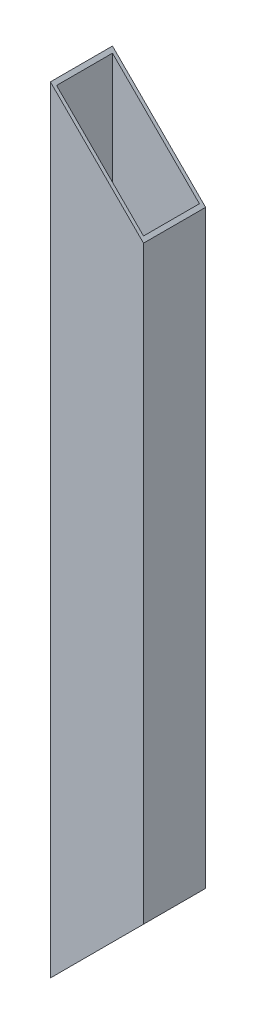
ISO-10303-21;
HEADER;
FILE_DESCRIPTION(('STEP AP214'),'2;1');
FILE_NAME('part.step','',(''),(''),'','','');
FILE_SCHEMA(('AUTOMOTIVE_DESIGN { 1 0 10303 214 1 1 1 1 }'));
ENDSEC;
DATA;
#1=APPLICATION_CONTEXT('core data for automotive mechanical design processes');
#2=APPLICATION_PROTOCOL_DEFINITION('international standard','automotive_design',2000,#1);
#3=PRODUCT_CONTEXT('',#1,'mechanical');
#4=PRODUCT('Part','Part','',(#3));
#5=PRODUCT_RELATED_PRODUCT_CATEGORY('part','',(#4));
#6=PRODUCT_DEFINITION_FORMATION('','',#4);
#7=PRODUCT_DEFINITION_CONTEXT('part definition',#1,'design');
#8=PRODUCT_DEFINITION('design','',#6,#7);
#9=PRODUCT_DEFINITION_SHAPE('','',#8);
#10=(LENGTH_UNIT() NAMED_UNIT(*) SI_UNIT(.MILLI.,.METRE.));
#11=(NAMED_UNIT(*) PLANE_ANGLE_UNIT() SI_UNIT($,.RADIAN.));
#12=(NAMED_UNIT(*) SI_UNIT($,.STERADIAN.) SOLID_ANGLE_UNIT());
#13=UNCERTAINTY_MEASURE_WITH_UNIT(LENGTH_MEASURE(1.E-05),#10,'distance_accuracy_value','');
#14=(GEOMETRIC_REPRESENTATION_CONTEXT(3) GLOBAL_UNCERTAINTY_ASSIGNED_CONTEXT((#13)) GLOBAL_UNIT_ASSIGNED_CONTEXT((#10,
#11,#12)) REPRESENTATION_CONTEXT('',''));
#15=CARTESIAN_POINT('',(0.,0.,0.));
#16=DIRECTION('',(0.,0.,1.));
#17=DIRECTION('',(1.,0.,0.));
#18=AXIS2_PLACEMENT_3D('',#15,#16,#17);
#19=CARTESIAN_POINT('',(2.,500.,-38.));
#20=DIRECTION('',(0.,0.,1.));
#21=DIRECTION('',(1.,0.,0.));
#22=AXIS2_PLACEMENT_3D('',#19,#20,#21);
#23=PLANE('',#22);
#24=DIRECTION('',(0.,-1.,0.));
#25=VECTOR('',#24,1.);
#26=CARTESIAN_POINT('',(58.,500.,-38.));
#27=LINE('',#26,#25);
#28=CARTESIAN_POINT('',(58.,442.,-38.));
#29=VERTEX_POINT('',#28);
#30=CARTESIAN_POINT('',(58.,58.0000000000006,-38.));
#31=VERTEX_POINT('',#30);
#32=EDGE_CURVE('E150',#29,#31,#27,.T.);
#33=ORIENTED_EDGE('',*,*,#32,.F.);
#34=DIRECTION('',(-0.707106781186546,0.707106781186549,0.));
#35=VECTOR('',#34,1.);
#36=CARTESIAN_POINT('',(0.999999999999982,499.,-38.));
#37=LINE('',#36,#35);
#38=CARTESIAN_POINT('',(1.99999999999999,498.,-38.));
#39=VERTEX_POINT('',#38);
#40=EDGE_CURVE('E11',#29,#39,#37,.T.);
#41=ORIENTED_EDGE('',*,*,#40,.T.);
#42=DIRECTION('',(0.,-1.,0.));
#43=VECTOR('',#42,1.);
#44=CARTESIAN_POINT('',(2.,500.,-38.));
#45=LINE('',#44,#43);
#46=CARTESIAN_POINT('',(2.00000000000003,2.00000000000009,-38.));
#47=VERTEX_POINT('',#46);
#48=EDGE_CURVE('E145',#39,#47,#45,.T.);
#49=ORIENTED_EDGE('',*,*,#48,.T.);
#50=DIRECTION('',(-0.707106781186544,-0.707106781186551,0.));
#51=VECTOR('',#50,1.);
#52=CARTESIAN_POINT('',(251.,251.000000000003,-38.));
#53=LINE('',#52,#51);
#54=EDGE_CURVE('E41',#31,#47,#53,.T.);
#55=ORIENTED_EDGE('',*,*,#54,.F.);
#56=EDGE_LOOP('',(#33,#41,#49,#55));
#57=FACE_BOUND('',#56,.T.);
#58=ADVANCED_FACE('F33',(#57),#23,.T.);
#59=CARTESIAN_POINT('',(58.,500.,-38.));
#60=DIRECTION('',(-1.,0.,0.));
#61=DIRECTION('',(0.,0.,1.));
#62=AXIS2_PLACEMENT_3D('',#59,#60,#61);
#63=PLANE('',#62);
#64=DIRECTION('',(0.,-1.,0.));
#65=VECTOR('',#64,1.);
#66=CARTESIAN_POINT('',(58.,500.,-2.));
#67=LINE('',#66,#65);
#68=CARTESIAN_POINT('',(58.,442.,-2.));
#69=VERTEX_POINT('',#68);
#70=CARTESIAN_POINT('',(58.,58.0000000000007,-2.));
#71=VERTEX_POINT('',#70);
#72=EDGE_CURVE('E153',#69,#71,#67,.T.);
#73=ORIENTED_EDGE('',*,*,#72,.F.);
#74=DIRECTION('',(0.,0.,-1.));
#75=VECTOR('',#74,1.);
#76=CARTESIAN_POINT('',(58.,442.,-38.));
#77=LINE('',#76,#75);
#78=EDGE_CURVE('E166',#69,#29,#77,.T.);
#79=ORIENTED_EDGE('',*,*,#78,.T.);
#80=ORIENTED_EDGE('',*,*,#32,.T.);
#81=DIRECTION('',(0.,0.,-1.));
#82=VECTOR('',#81,1.);
#83=CARTESIAN_POINT('',(58.,58.0000000000007,-37.9999999999999));
#84=LINE('',#83,#82);
#85=EDGE_CURVE('E136',#71,#31,#84,.T.);
#86=ORIENTED_EDGE('',*,*,#85,.F.);
#87=EDGE_LOOP('',(#73,#79,#80,#86));
#88=FACE_BOUND('',#87,.T.);
#89=ADVANCED_FACE('F165',(#88),#63,.T.);
#90=CARTESIAN_POINT('',(2.,500.,-2.));
#91=DIRECTION('',(0.,0.,-1.));
#92=DIRECTION('',(-1.,0.,0.));
#93=AXIS2_PLACEMENT_3D('',#90,#91,#92);
#94=PLANE('',#93);
#95=DIRECTION('',(0.,-1.,0.));
#96=VECTOR('',#95,1.);
#97=CARTESIAN_POINT('',(2.,500.,-2.));
#98=LINE('',#97,#96);
#99=CARTESIAN_POINT('',(2.,498.,-2.));
#100=VERTEX_POINT('',#99);
#101=CARTESIAN_POINT('',(2.,2.,-2.));
#102=VERTEX_POINT('',#101);
#103=EDGE_CURVE('E119',#100,#102,#98,.T.);
#104=ORIENTED_EDGE('',*,*,#103,.F.);
#105=DIRECTION('',(0.707106781186546,-0.707106781186549,0.));
#106=VECTOR('',#105,1.);
#107=CARTESIAN_POINT('',(0.999999999999987,499.,-2.));
#108=LINE('',#107,#106);
#109=EDGE_CURVE('E162',#100,#69,#108,.T.);
#110=ORIENTED_EDGE('',*,*,#109,.T.);
#111=ORIENTED_EDGE('',*,*,#72,.T.);
#112=DIRECTION('',(0.707106781186544,0.707106781186551,0.));
#113=VECTOR('',#112,1.);
#114=CARTESIAN_POINT('',(251.,251.000000000003,-2.));
#115=LINE('',#114,#113);
#116=EDGE_CURVE('E148',#102,#71,#115,.T.);
#117=ORIENTED_EDGE('',*,*,#116,.F.);
#118=EDGE_LOOP('',(#104,#110,#111,#117));
#119=FACE_BOUND('',#118,.T.);
#120=ADVANCED_FACE('F161',(#119),#94,.T.);
#121=CARTESIAN_POINT('',(2.,500.,-38.));
#122=DIRECTION('',(1.,0.,0.));
#123=DIRECTION('',(0.,0.,-1.));
#124=AXIS2_PLACEMENT_3D('',#121,#122,#123);
#125=PLANE('',#124);
#126=ORIENTED_EDGE('',*,*,#48,.F.);
#127=DIRECTION('',(0.,0.,1.));
#128=VECTOR('',#127,1.);
#129=CARTESIAN_POINT('',(2.,498.,-38.));
#130=LINE('',#129,#128);
#131=EDGE_CURVE('E56',#39,#100,#130,.T.);
#132=ORIENTED_EDGE('',*,*,#131,.T.);
#133=ORIENTED_EDGE('',*,*,#103,.T.);
#134=DIRECTION('',(0.,0.,1.));
#135=VECTOR('',#134,1.);
#136=CARTESIAN_POINT('',(2.,2.00000000000006,-37.9999999999999));
#137=LINE('',#136,#135);
#138=EDGE_CURVE('E133',#47,#102,#137,.T.);
#139=ORIENTED_EDGE('',*,*,#138,.F.);
#140=EDGE_LOOP('',(#126,#132,#133,#139));
#141=FACE_BOUND('',#140,.T.);
#142=ADVANCED_FACE('F144',(#141),#125,.T.);
#143=CARTESIAN_POINT('',(0.,0.,660.));
#144=DIRECTION('',(-0.707106781186551,0.707106781186544,0.));
#145=DIRECTION('',(-0.707106781186544,-0.707106781186551,0.));
#146=AXIS2_PLACEMENT_3D('',#143,#144,#145);
#147=PLANE('',#146);
#148=ORIENTED_EDGE('',*,*,#138,.T.);
#149=ORIENTED_EDGE('',*,*,#116,.T.);
#150=ORIENTED_EDGE('',*,*,#85,.T.);
#151=ORIENTED_EDGE('',*,*,#54,.T.);
#152=EDGE_LOOP('',(#148,#149,#150,#151));
#153=FACE_BOUND('',#152,.T.);
#154=DIRECTION('',(0.,0.,1.));
#155=VECTOR('',#154,1.);
#156=CARTESIAN_POINT('',(0.,0.,0.));
#157=LINE('',#156,#155);
#158=CARTESIAN_POINT('',(0.,0.,-40.));
#159=VERTEX_POINT('',#158);
#160=CARTESIAN_POINT('',(0.,0.,0.));
#161=VERTEX_POINT('',#160);
#162=EDGE_CURVE('E117',#159,#161,#157,.T.);
#163=ORIENTED_EDGE('',*,*,#162,.F.);
#164=DIRECTION('',(0.707106781186544,0.707106781186551,0.));
#165=VECTOR('',#164,1.);
#166=CARTESIAN_POINT('',(0.,0.,-40.));
#167=LINE('',#166,#165);
#168=CARTESIAN_POINT('',(60.,60.0000000000007,-40.));
#169=VERTEX_POINT('',#168);
#170=EDGE_CURVE('E109',#159,#169,#167,.T.);
#171=ORIENTED_EDGE('',*,*,#170,.T.);
#172=DIRECTION('',(0.,0.,-1.));
#173=VECTOR('',#172,1.);
#174=CARTESIAN_POINT('',(60.,60.0000000000007,660.));
#175=LINE('',#174,#173);
#176=CARTESIAN_POINT('',(60.,60.0000000000007,0.));
#177=VERTEX_POINT('',#176);
#178=EDGE_CURVE('E103',#177,#169,#175,.T.);
#179=ORIENTED_EDGE('',*,*,#178,.F.);
#180=DIRECTION('',(0.707106781186544,0.707106781186551,0.));
#181=VECTOR('',#180,1.);
#182=CARTESIAN_POINT('',(250.,250.000000000003,0.));
#183=LINE('',#182,#181);
#184=EDGE_CURVE('E147',#161,#177,#183,.T.);
#185=ORIENTED_EDGE('',*,*,#184,.F.);
#186=EDGE_LOOP('',(#163,#171,#179,#185));
#187=FACE_BOUND('',#186,.T.);
#188=ADVANCED_FACE('F131',(#153,#187),#147,.F.);
#189=CARTESIAN_POINT('',(250.,249.999999999999,660.));
#190=DIRECTION('',(0.707106781186549,0.707106781186546,0.));
#191=DIRECTION('',(-0.707106781186546,0.707106781186549,0.));
#192=AXIS2_PLACEMENT_3D('',#189,#190,#191);
#193=PLANE('',#192);
#194=ORIENTED_EDGE('',*,*,#40,.F.);
#195=ORIENTED_EDGE('',*,*,#78,.F.);
#196=ORIENTED_EDGE('',*,*,#109,.F.);
#197=ORIENTED_EDGE('',*,*,#131,.F.);
#198=EDGE_LOOP('',(#194,#195,#196,#197));
#199=FACE_BOUND('',#198,.T.);
#200=DIRECTION('',(0.707106781186546,-0.707106781186549,0.));
#201=VECTOR('',#200,1.);
#202=CARTESIAN_POINT('',(0.,500.,0.));
#203=LINE('',#202,#201);
#204=CARTESIAN_POINT('',(0.,500.,0.));
#205=VERTEX_POINT('',#204);
#206=CARTESIAN_POINT('',(60.,440.,0.));
#207=VERTEX_POINT('',#206);
#208=EDGE_CURVE('E151',#205,#207,#203,.T.);
#209=ORIENTED_EDGE('',*,*,#208,.T.);
#210=DIRECTION('',(0.,0.,-1.));
#211=VECTOR('',#210,1.);
#212=CARTESIAN_POINT('',(60.,440.,660.));
#213=LINE('',#212,#211);
#214=CARTESIAN_POINT('',(60.,440.,-40.));
#215=VERTEX_POINT('',#214);
#216=EDGE_CURVE('E48',#207,#215,#213,.T.);
#217=ORIENTED_EDGE('',*,*,#216,.T.);
#218=DIRECTION('',(0.707106781186546,-0.707106781186549,0.));
#219=VECTOR('',#218,1.);
#220=CARTESIAN_POINT('',(250.,249.999999999999,-40.));
#221=LINE('',#220,#219);
#222=CARTESIAN_POINT('',(0.,500.,-40.));
#223=VERTEX_POINT('',#222);
#224=EDGE_CURVE('E94',#223,#215,#221,.T.);
#225=ORIENTED_EDGE('',*,*,#224,.F.);
#226=DIRECTION('',(0.,0.,1.));
#227=VECTOR('',#226,1.);
#228=CARTESIAN_POINT('',(0.,500.,0.));
#229=LINE('',#228,#227);
#230=EDGE_CURVE('E98',#223,#205,#229,.T.);
#231=ORIENTED_EDGE('',*,*,#230,.T.);
#232=EDGE_LOOP('',(#209,#217,#225,#231));
#233=FACE_BOUND('',#232,.T.);
#234=ADVANCED_FACE('F96',(#199,#233),#193,.T.);
#235=CARTESIAN_POINT('',(0.,500.,0.));
#236=DIRECTION('',(0.,0.,-1.));
#237=DIRECTION('',(-1.,0.,0.));
#238=AXIS2_PLACEMENT_3D('',#235,#236,#237);
#239=PLANE('',#238);
#240=ORIENTED_EDGE('',*,*,#208,.F.);
#241=DIRECTION('',(0.,-1.,0.));
#242=VECTOR('',#241,1.);
#243=CARTESIAN_POINT('',(0.,500.,0.));
#244=LINE('',#243,#242);
#245=EDGE_CURVE('E116',#205,#161,#244,.T.);
#246=ORIENTED_EDGE('',*,*,#245,.T.);
#247=ORIENTED_EDGE('',*,*,#184,.T.);
#248=DIRECTION('',(0.,-1.,0.));
#249=VECTOR('',#248,1.);
#250=CARTESIAN_POINT('',(60.,500.,0.));
#251=LINE('',#250,#249);
#252=EDGE_CURVE('E125',#207,#177,#251,.T.);
#253=ORIENTED_EDGE('',*,*,#252,.F.);
#254=EDGE_LOOP('',(#240,#246,#247,#253));
#255=FACE_BOUND('',#254,.T.);
#256=ADVANCED_FACE('F178',(#255),#239,.F.);
#257=CARTESIAN_POINT('',(60.,500.,0.));
#258=DIRECTION('',(-1.,0.,0.));
#259=DIRECTION('',(0.,0.,1.));
#260=AXIS2_PLACEMENT_3D('',#257,#258,#259);
#261=PLANE('',#260);
#262=ORIENTED_EDGE('',*,*,#216,.F.);
#263=ORIENTED_EDGE('',*,*,#252,.T.);
#264=ORIENTED_EDGE('',*,*,#178,.T.);
#265=DIRECTION('',(0.,-1.,0.));
#266=VECTOR('',#265,1.);
#267=CARTESIAN_POINT('',(60.,500.,-40.));
#268=LINE('',#267,#266);
#269=EDGE_CURVE('E112',#215,#169,#268,.T.);
#270=ORIENTED_EDGE('',*,*,#269,.F.);
#271=EDGE_LOOP('',(#262,#263,#264,#270));
#272=FACE_BOUND('',#271,.T.);
#273=ADVANCED_FACE('F181',(#272),#261,.F.);
#274=CARTESIAN_POINT('',(0.,500.,-40.));
#275=DIRECTION('',(0.,0.,1.));
#276=DIRECTION('',(1.,0.,0.));
#277=AXIS2_PLACEMENT_3D('',#274,#275,#276);
#278=PLANE('',#277);
#279=ORIENTED_EDGE('',*,*,#224,.T.);
#280=ORIENTED_EDGE('',*,*,#269,.T.);
#281=ORIENTED_EDGE('',*,*,#170,.F.);
#282=DIRECTION('',(0.,-1.,0.));
#283=VECTOR('',#282,1.);
#284=CARTESIAN_POINT('',(0.,500.,-40.));
#285=LINE('',#284,#283);
#286=EDGE_CURVE('E107',#223,#159,#285,.T.);
#287=ORIENTED_EDGE('',*,*,#286,.F.);
#288=EDGE_LOOP('',(#279,#280,#281,#287));
#289=FACE_BOUND('',#288,.T.);
#290=ADVANCED_FACE('F108',(#289),#278,.F.);
#291=CARTESIAN_POINT('',(0.,500.,0.));
#292=DIRECTION('',(1.,0.,0.));
#293=DIRECTION('',(0.,0.,-1.));
#294=AXIS2_PLACEMENT_3D('',#291,#292,#293);
#295=PLANE('',#294);
#296=ORIENTED_EDGE('',*,*,#162,.T.);
#297=ORIENTED_EDGE('',*,*,#245,.F.);
#298=ORIENTED_EDGE('',*,*,#230,.F.);
#299=ORIENTED_EDGE('',*,*,#286,.T.);
#300=EDGE_LOOP('',(#296,#297,#298,#299));
#301=FACE_BOUND('',#300,.T.);
#302=ADVANCED_FACE('F35',(#301),#295,.F.);
#303=CLOSED_SHELL('',(#58,#89,#120,#142,#188,#234,#256,#273,#290,#302));
#304=MANIFOLD_SOLID_BREP('B2',#303);
#305=ADVANCED_BREP_SHAPE_REPRESENTATION('',(#18,#304),#14);
#306=SHAPE_DEFINITION_REPRESENTATION(#9,#305);
ENDSEC;
END-ISO-10303-21;
